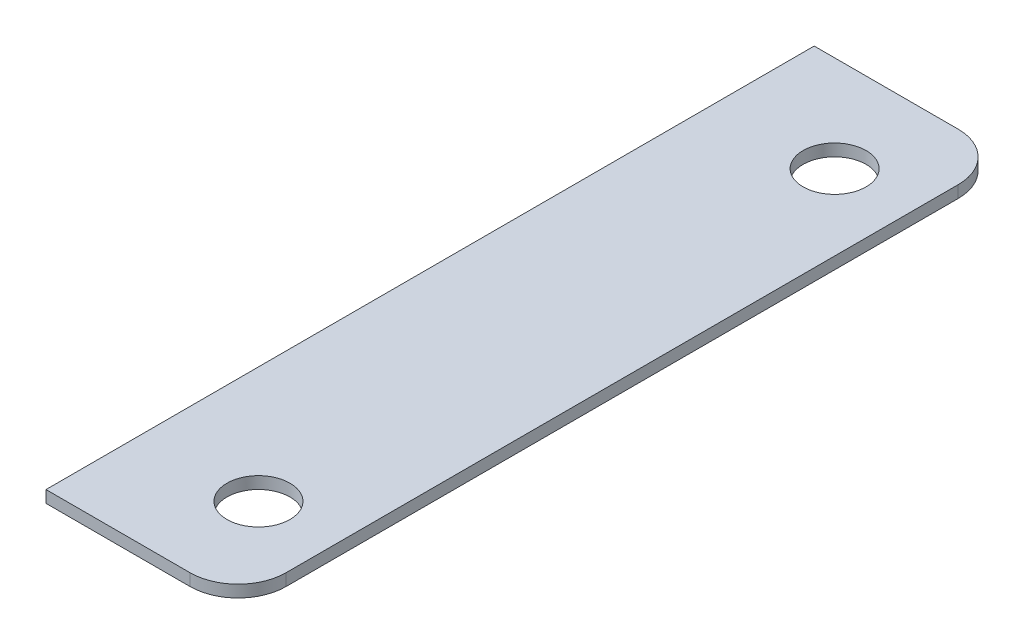
ISO-10303-21;
HEADER;
FILE_DESCRIPTION(('STEP AP214'),'2;1');
FILE_NAME('part.step','',(''),(''),'','','');
FILE_SCHEMA(('AUTOMOTIVE_DESIGN { 1 0 10303 214 1 1 1 1 }'));
ENDSEC;
DATA;
#1=APPLICATION_CONTEXT('core data for automotive mechanical design processes');
#2=APPLICATION_PROTOCOL_DEFINITION('international standard','automotive_design',2000,#1);
#3=PRODUCT_CONTEXT('',#1,'mechanical');
#4=PRODUCT('Part','Part','',(#3));
#5=PRODUCT_RELATED_PRODUCT_CATEGORY('part','',(#4));
#6=PRODUCT_DEFINITION_FORMATION('','',#4);
#7=PRODUCT_DEFINITION_CONTEXT('part definition',#1,'design');
#8=PRODUCT_DEFINITION('design','',#6,#7);
#9=PRODUCT_DEFINITION_SHAPE('','',#8);
#10=(LENGTH_UNIT() NAMED_UNIT(*) SI_UNIT(.MILLI.,.METRE.));
#11=(NAMED_UNIT(*) PLANE_ANGLE_UNIT() SI_UNIT($,.RADIAN.));
#12=(NAMED_UNIT(*) SI_UNIT($,.STERADIAN.) SOLID_ANGLE_UNIT());
#13=UNCERTAINTY_MEASURE_WITH_UNIT(LENGTH_MEASURE(1.E-05),#10,'distance_accuracy_value','');
#14=(GEOMETRIC_REPRESENTATION_CONTEXT(3) GLOBAL_UNCERTAINTY_ASSIGNED_CONTEXT((#13)) GLOBAL_UNIT_ASSIGNED_CONTEXT((#10,
#11,#12)) REPRESENTATION_CONTEXT('',''));
#15=CARTESIAN_POINT('',(0.,0.,0.));
#16=DIRECTION('',(0.,0.,1.));
#17=DIRECTION('',(1.,0.,0.));
#18=AXIS2_PLACEMENT_3D('',#15,#16,#17);
#19=CARTESIAN_POINT('',(12.7,1.5875,-50.8));
#20=DIRECTION('',(-1.,0.,0.));
#21=DIRECTION('',(0.,0.,1.));
#22=AXIS2_PLACEMENT_3D('',#19,#20,#21);
#23=PLANE('',#22);
#24=DIRECTION('',(0.,0.,-1.));
#25=VECTOR('',#24,1.);
#26=CARTESIAN_POINT('',(12.7,0.,-50.8));
#27=LINE('',#26,#25);
#28=CARTESIAN_POINT('',(12.7,0.,44.45));
#29=VERTEX_POINT('',#28);
#30=CARTESIAN_POINT('',(12.7,0.,-44.45));
#31=VERTEX_POINT('',#30);
#32=EDGE_CURVE('E140',#29,#31,#27,.T.);
#33=ORIENTED_EDGE('',*,*,#32,.T.);
#34=DIRECTION('',(0.,-1.,0.));
#35=VECTOR('',#34,1.);
#36=CARTESIAN_POINT('',(12.7,1.5875,-44.45));
#37=LINE('',#36,#35);
#38=CARTESIAN_POINT('',(12.7,1.5875,-44.45));
#39=VERTEX_POINT('',#38);
#40=EDGE_CURVE('E66',#31,#39,#37,.F.);
#41=ORIENTED_EDGE('',*,*,#40,.T.);
#42=DIRECTION('',(0.,0.,-1.));
#43=VECTOR('',#42,1.);
#44=CARTESIAN_POINT('',(12.7,1.5875,-50.8));
#45=LINE('',#44,#43);
#46=CARTESIAN_POINT('',(12.7,1.5875,44.45));
#47=VERTEX_POINT('',#46);
#48=EDGE_CURVE('E117',#47,#39,#45,.T.);
#49=ORIENTED_EDGE('',*,*,#48,.F.);
#50=DIRECTION('',(0.,-1.,0.));
#51=VECTOR('',#50,1.);
#52=CARTESIAN_POINT('',(12.7,1.5875,44.45));
#53=LINE('',#52,#51);
#54=EDGE_CURVE('E161',#47,#29,#53,.T.);
#55=ORIENTED_EDGE('',*,*,#54,.T.);
#56=EDGE_LOOP('',(#33,#41,#49,#55));
#57=FACE_BOUND('',#56,.T.);
#58=ADVANCED_FACE('F39',(#57),#23,.F.);
#59=CARTESIAN_POINT('',(-12.7,1.5875,-50.8));
#60=DIRECTION('',(0.,0.,1.));
#61=DIRECTION('',(1.,0.,0.));
#62=AXIS2_PLACEMENT_3D('',#59,#60,#61);
#63=PLANE('',#62);
#64=DIRECTION('',(-1.,0.,0.));
#65=VECTOR('',#64,1.);
#66=CARTESIAN_POINT('',(-12.7,1.5875,-50.8));
#67=LINE('',#66,#65);
#68=CARTESIAN_POINT('',(6.34999999999999,1.5875,-50.8));
#69=VERTEX_POINT('',#68);
#70=CARTESIAN_POINT('',(-12.7,1.5875,-50.8));
#71=VERTEX_POINT('',#70);
#72=EDGE_CURVE('E106',#69,#71,#67,.T.);
#73=ORIENTED_EDGE('',*,*,#72,.F.);
#74=DIRECTION('',(0.,-1.,0.));
#75=VECTOR('',#74,1.);
#76=CARTESIAN_POINT('',(6.34999999999999,1.5875,-50.8));
#77=LINE('',#76,#75);
#78=CARTESIAN_POINT('',(6.34999999999999,0.,-50.8));
#79=VERTEX_POINT('',#78);
#80=EDGE_CURVE('E127',#69,#79,#77,.T.);
#81=ORIENTED_EDGE('',*,*,#80,.T.);
#82=DIRECTION('',(-1.,0.,0.));
#83=VECTOR('',#82,1.);
#84=CARTESIAN_POINT('',(-12.7,0.,-50.8));
#85=LINE('',#84,#83);
#86=CARTESIAN_POINT('',(-12.7,0.,-50.8));
#87=VERTEX_POINT('',#86);
#88=EDGE_CURVE('E123',#79,#87,#85,.T.);
#89=ORIENTED_EDGE('',*,*,#88,.T.);
#90=DIRECTION('',(0.,-1.,0.));
#91=VECTOR('',#90,1.);
#92=CARTESIAN_POINT('',(-12.7,1.5875,-50.8));
#93=LINE('',#92,#91);
#94=EDGE_CURVE('E120',#71,#87,#93,.T.);
#95=ORIENTED_EDGE('',*,*,#94,.F.);
#96=EDGE_LOOP('',(#73,#81,#89,#95));
#97=FACE_BOUND('',#96,.T.);
#98=ADVANCED_FACE('F121',(#97),#63,.F.);
#99=CARTESIAN_POINT('',(-12.7,1.5875,-50.8));
#100=DIRECTION('',(1.,0.,0.));
#101=DIRECTION('',(0.,0.,-1.));
#102=AXIS2_PLACEMENT_3D('',#99,#100,#101);
#103=PLANE('',#102);
#104=DIRECTION('',(0.,0.,1.));
#105=VECTOR('',#104,1.);
#106=CARTESIAN_POINT('',(-12.7,0.,-50.8));
#107=LINE('',#106,#105);
#108=CARTESIAN_POINT('',(-12.7,0.,50.8));
#109=VERTEX_POINT('',#108);
#110=EDGE_CURVE('E146',#87,#109,#107,.T.);
#111=ORIENTED_EDGE('',*,*,#110,.T.);
#112=DIRECTION('',(0.,-1.,0.));
#113=VECTOR('',#112,1.);
#114=CARTESIAN_POINT('',(-12.7,1.5875,50.8));
#115=LINE('',#114,#113);
#116=CARTESIAN_POINT('',(-12.7,1.5875,50.8));
#117=VERTEX_POINT('',#116);
#118=EDGE_CURVE('E128',#117,#109,#115,.T.);
#119=ORIENTED_EDGE('',*,*,#118,.F.);
#120=DIRECTION('',(0.,0.,1.));
#121=VECTOR('',#120,1.);
#122=CARTESIAN_POINT('',(-12.7,1.5875,-50.8));
#123=LINE('',#122,#121);
#124=EDGE_CURVE('E110',#71,#117,#123,.T.);
#125=ORIENTED_EDGE('',*,*,#124,.F.);
#126=ORIENTED_EDGE('',*,*,#94,.T.);
#127=EDGE_LOOP('',(#111,#119,#125,#126));
#128=FACE_BOUND('',#127,.T.);
#129=ADVANCED_FACE('F130',(#128),#103,.F.);
#130=CARTESIAN_POINT('',(-12.7,1.5875,50.8));
#131=DIRECTION('',(0.,0.,-1.));
#132=DIRECTION('',(-1.,0.,0.));
#133=AXIS2_PLACEMENT_3D('',#130,#131,#132);
#134=PLANE('',#133);
#135=DIRECTION('',(1.,0.,0.));
#136=VECTOR('',#135,1.);
#137=CARTESIAN_POINT('',(-12.7,0.,50.8));
#138=LINE('',#137,#136);
#139=CARTESIAN_POINT('',(6.35,0.,50.8));
#140=VERTEX_POINT('',#139);
#141=EDGE_CURVE('E148',#109,#140,#138,.T.);
#142=ORIENTED_EDGE('',*,*,#141,.T.);
#143=DIRECTION('',(0.,-1.,0.));
#144=VECTOR('',#143,1.);
#145=CARTESIAN_POINT('',(6.35,1.5875,50.8));
#146=LINE('',#145,#144);
#147=CARTESIAN_POINT('',(6.35,1.5875,50.8));
#148=VERTEX_POINT('',#147);
#149=EDGE_CURVE('E11',#140,#148,#146,.F.);
#150=ORIENTED_EDGE('',*,*,#149,.T.);
#151=DIRECTION('',(1.,0.,0.));
#152=VECTOR('',#151,1.);
#153=CARTESIAN_POINT('',(-12.7,1.5875,50.8));
#154=LINE('',#153,#152);
#155=EDGE_CURVE('E133',#117,#148,#154,.T.);
#156=ORIENTED_EDGE('',*,*,#155,.F.);
#157=ORIENTED_EDGE('',*,*,#118,.T.);
#158=EDGE_LOOP('',(#142,#150,#156,#157));
#159=FACE_BOUND('',#158,.T.);
#160=ADVANCED_FACE('F200',(#159),#134,.F.);
#161=CARTESIAN_POINT('',(0.,1.5875,0.));
#162=DIRECTION('',(0.,1.,0.));
#163=DIRECTION('',(0.,0.,1.));
#164=AXIS2_PLACEMENT_3D('',#161,#162,#163);
#165=PLANE('',#164);
#166=CARTESIAN_POINT('',(2.69999999999998,1.5875,-38.1));
#167=DIRECTION('',(0.,1.,0.));
#168=DIRECTION('',(0.,0.,1.));
#169=AXIS2_PLACEMENT_3D('',#166,#167,#168);
#170=CIRCLE('',#169,4.165);
#171=CARTESIAN_POINT('',(2.69999999999998,1.5875,-33.935));
#172=VERTEX_POINT('',#171);
#173=EDGE_CURVE('E172',#172,#172,#170,.T.);
#174=ORIENTED_EDGE('',*,*,#173,.F.);
#175=EDGE_LOOP('',(#174));
#176=FACE_BOUND('',#175,.T.);
#177=CARTESIAN_POINT('',(2.69999999999998,1.5875,38.1));
#178=DIRECTION('',(0.,1.,0.));
#179=DIRECTION('',(0.,0.,-1.));
#180=AXIS2_PLACEMENT_3D('',#177,#178,#179);
#181=CIRCLE('',#180,4.165);
#182=CARTESIAN_POINT('',(2.69999999999998,1.5875,33.935));
#183=VERTEX_POINT('',#182);
#184=EDGE_CURVE('E182',#183,#183,#181,.T.);
#185=ORIENTED_EDGE('',*,*,#184,.F.);
#186=EDGE_LOOP('',(#185));
#187=FACE_BOUND('',#186,.T.);
#188=ORIENTED_EDGE('',*,*,#48,.T.);
#189=CARTESIAN_POINT('',(6.34999999999999,1.5875,-44.45));
#190=DIRECTION('',(0.,1.,0.));
#191=DIRECTION('',(0.,0.,1.));
#192=AXIS2_PLACEMENT_3D('',#189,#190,#191);
#193=CIRCLE('',#192,6.35);
#194=EDGE_CURVE('E48',#39,#69,#193,.T.);
#195=ORIENTED_EDGE('',*,*,#194,.T.);
#196=ORIENTED_EDGE('',*,*,#72,.T.);
#197=ORIENTED_EDGE('',*,*,#124,.T.);
#198=ORIENTED_EDGE('',*,*,#155,.T.);
#199=CARTESIAN_POINT('',(6.35,1.5875,44.45));
#200=DIRECTION('',(0.,1.,0.));
#201=DIRECTION('',(0.,0.,1.));
#202=AXIS2_PLACEMENT_3D('',#199,#200,#201);
#203=CIRCLE('',#202,6.35);
#204=EDGE_CURVE('E167',#148,#47,#203,.T.);
#205=ORIENTED_EDGE('',*,*,#204,.T.);
#206=EDGE_LOOP('',(#188,#195,#196,#197,#198,#205));
#207=FACE_BOUND('',#206,.T.);
#208=ADVANCED_FACE('F108',(#176,#187,#207),#165,.T.);
#209=CARTESIAN_POINT('',(0.,0.,0.));
#210=DIRECTION('',(0.,1.,0.));
#211=DIRECTION('',(0.,0.,1.));
#212=AXIS2_PLACEMENT_3D('',#209,#210,#211);
#213=PLANE('',#212);
#214=CARTESIAN_POINT('',(2.69999999999998,0.,-38.1));
#215=DIRECTION('',(0.,1.,0.));
#216=DIRECTION('',(0.,0.,1.));
#217=AXIS2_PLACEMENT_3D('',#214,#215,#216);
#218=CIRCLE('',#217,4.165);
#219=CARTESIAN_POINT('',(2.69999999999998,0.,-33.935));
#220=VERTEX_POINT('',#219);
#221=EDGE_CURVE('E143',#220,#220,#218,.F.);
#222=ORIENTED_EDGE('',*,*,#221,.F.);
#223=EDGE_LOOP('',(#222));
#224=FACE_BOUND('',#223,.T.);
#225=CARTESIAN_POINT('',(2.69999999999998,0.,38.1));
#226=DIRECTION('',(0.,1.,0.));
#227=DIRECTION('',(0.,0.,1.));
#228=AXIS2_PLACEMENT_3D('',#225,#226,#227);
#229=CIRCLE('',#228,4.165);
#230=CARTESIAN_POINT('',(2.69999999999998,0.,42.265));
#231=VERTEX_POINT('',#230);
#232=EDGE_CURVE('E175',#231,#231,#229,.F.);
#233=ORIENTED_EDGE('',*,*,#232,.F.);
#234=EDGE_LOOP('',(#233));
#235=FACE_BOUND('',#234,.T.);
#236=ORIENTED_EDGE('',*,*,#88,.F.);
#237=CARTESIAN_POINT('',(6.34999999999999,0.,-44.45));
#238=DIRECTION('',(0.,1.,0.));
#239=DIRECTION('',(0.,0.,1.));
#240=AXIS2_PLACEMENT_3D('',#237,#238,#239);
#241=CIRCLE('',#240,6.35);
#242=EDGE_CURVE('E158',#79,#31,#241,.F.);
#243=ORIENTED_EDGE('',*,*,#242,.T.);
#244=ORIENTED_EDGE('',*,*,#32,.F.);
#245=CARTESIAN_POINT('',(6.35,0.,44.45));
#246=DIRECTION('',(0.,1.,0.));
#247=DIRECTION('',(0.,0.,1.));
#248=AXIS2_PLACEMENT_3D('',#245,#246,#247);
#249=CIRCLE('',#248,6.35);
#250=EDGE_CURVE('E155',#29,#140,#249,.F.);
#251=ORIENTED_EDGE('',*,*,#250,.T.);
#252=ORIENTED_EDGE('',*,*,#141,.F.);
#253=ORIENTED_EDGE('',*,*,#110,.F.);
#254=EDGE_LOOP('',(#236,#243,#244,#251,#252,#253));
#255=FACE_BOUND('',#254,.T.);
#256=ADVANCED_FACE('F192',(#224,#235,#255),#213,.F.);
#257=CARTESIAN_POINT('',(6.34999999999999,1.5875,-44.45));
#258=DIRECTION('',(0.,-1.,0.));
#259=DIRECTION('',(0.,0.,-1.));
#260=AXIS2_PLACEMENT_3D('',#257,#258,#259);
#261=CYLINDRICAL_SURFACE('',#260,6.35);
#262=ORIENTED_EDGE('',*,*,#194,.F.);
#263=ORIENTED_EDGE('',*,*,#40,.F.);
#264=ORIENTED_EDGE('',*,*,#242,.F.);
#265=ORIENTED_EDGE('',*,*,#80,.F.);
#266=EDGE_LOOP('',(#262,#263,#264,#265));
#267=FACE_BOUND('',#266,.T.);
#268=ADVANCED_FACE('F195',(#267),#261,.T.);
#269=CARTESIAN_POINT('',(6.35,1.5875,44.45));
#270=DIRECTION('',(0.,-1.,0.));
#271=DIRECTION('',(0.,0.,-1.));
#272=AXIS2_PLACEMENT_3D('',#269,#270,#271);
#273=CYLINDRICAL_SURFACE('',#272,6.35);
#274=ORIENTED_EDGE('',*,*,#204,.F.);
#275=ORIENTED_EDGE('',*,*,#149,.F.);
#276=ORIENTED_EDGE('',*,*,#250,.F.);
#277=ORIENTED_EDGE('',*,*,#54,.F.);
#278=EDGE_LOOP('',(#274,#275,#276,#277));
#279=FACE_BOUND('',#278,.T.);
#280=ADVANCED_FACE('F41',(#279),#273,.T.);
#281=CARTESIAN_POINT('',(2.69999999999998,-0.000999999999999916,38.1));
#282=DIRECTION('',(0.,1.,0.));
#283=DIRECTION('',(0.,0.,1.));
#284=AXIS2_PLACEMENT_3D('',#281,#282,#283);
#285=CYLINDRICAL_SURFACE('',#284,4.165);
#286=ORIENTED_EDGE('',*,*,#184,.T.);
#287=EDGE_LOOP('',(#286));
#288=FACE_BOUND('',#287,.T.);
#289=ORIENTED_EDGE('',*,*,#232,.T.);
#290=EDGE_LOOP('',(#289));
#291=FACE_BOUND('',#290,.T.);
#292=ADVANCED_FACE('F190',(#288,#291),#285,.F.);
#293=CARTESIAN_POINT('',(2.69999999999998,-0.000999999999999916,-38.1));
#294=DIRECTION('',(0.,1.,0.));
#295=DIRECTION('',(0.,0.,1.));
#296=AXIS2_PLACEMENT_3D('',#293,#294,#295);
#297=CYLINDRICAL_SURFACE('',#296,4.165);
#298=ORIENTED_EDGE('',*,*,#173,.T.);
#299=EDGE_LOOP('',(#298));
#300=FACE_BOUND('',#299,.T.);
#301=ORIENTED_EDGE('',*,*,#221,.T.);
#302=EDGE_LOOP('',(#301));
#303=FACE_BOUND('',#302,.T.);
#304=ADVANCED_FACE('F225',(#300,#303),#297,.F.);
#305=CLOSED_SHELL('',(#58,#98,#129,#160,#208,#256,#268,#280,#292,#304));
#306=MANIFOLD_SOLID_BREP('B2',#305);
#307=ADVANCED_BREP_SHAPE_REPRESENTATION('',(#18,#306),#14);
#308=SHAPE_DEFINITION_REPRESENTATION(#9,#307);
ENDSEC;
END-ISO-10303-21;
